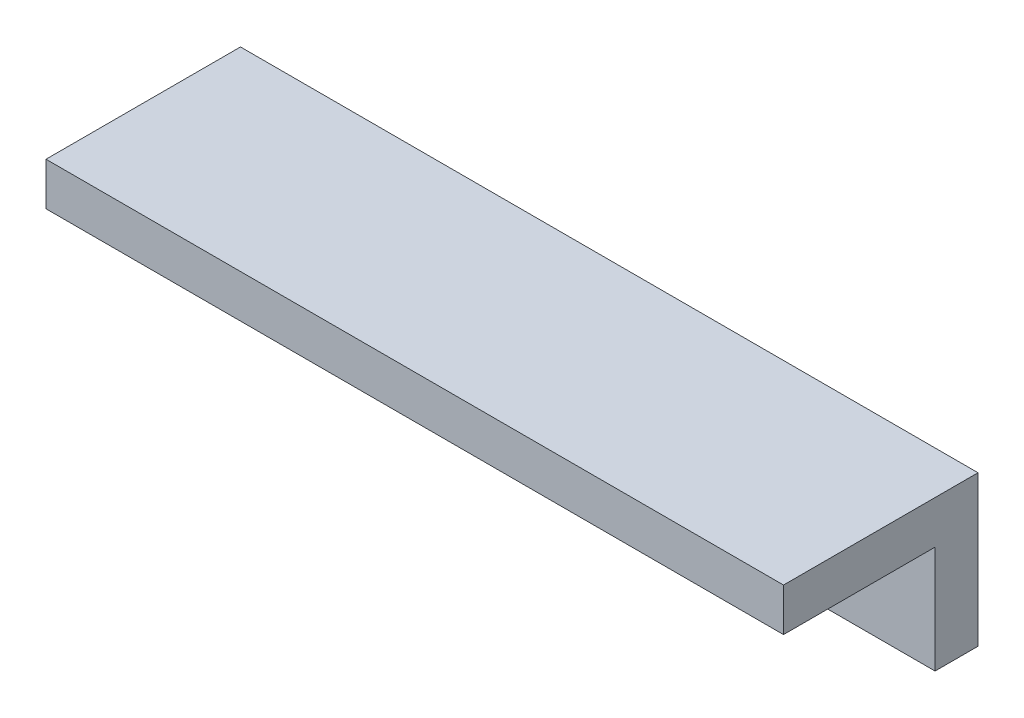
ISO-10303-21;
HEADER;
FILE_DESCRIPTION(('STEP AP214'),'2;1');
FILE_NAME('part.step','',(''),(''),'','','');
FILE_SCHEMA(('AUTOMOTIVE_DESIGN { 1 0 10303 214 1 1 1 1 }'));
ENDSEC;
DATA;
#1=APPLICATION_CONTEXT('core data for automotive mechanical design processes');
#2=APPLICATION_PROTOCOL_DEFINITION('international standard','automotive_design',2000,#1);
#3=PRODUCT_CONTEXT('',#1,'mechanical');
#4=PRODUCT('Part','Part','',(#3));
#5=PRODUCT_RELATED_PRODUCT_CATEGORY('part','',(#4));
#6=PRODUCT_DEFINITION_FORMATION('','',#4);
#7=PRODUCT_DEFINITION_CONTEXT('part definition',#1,'design');
#8=PRODUCT_DEFINITION('design','',#6,#7);
#9=PRODUCT_DEFINITION_SHAPE('','',#8);
#10=(LENGTH_UNIT() NAMED_UNIT(*) SI_UNIT(.MILLI.,.METRE.));
#11=(NAMED_UNIT(*) PLANE_ANGLE_UNIT() SI_UNIT($,.RADIAN.));
#12=(NAMED_UNIT(*) SI_UNIT($,.STERADIAN.) SOLID_ANGLE_UNIT());
#13=UNCERTAINTY_MEASURE_WITH_UNIT(LENGTH_MEASURE(1.E-05),#10,'distance_accuracy_value','');
#14=(GEOMETRIC_REPRESENTATION_CONTEXT(3) GLOBAL_UNCERTAINTY_ASSIGNED_CONTEXT((#13)) GLOBAL_UNIT_ASSIGNED_CONTEXT((#10,
#11,#12)) REPRESENTATION_CONTEXT('',''));
#15=CARTESIAN_POINT('',(0.,0.,0.));
#16=DIRECTION('',(0.,0.,1.));
#17=DIRECTION('',(1.,0.,0.));
#18=AXIS2_PLACEMENT_3D('',#15,#16,#17);
#19=CARTESIAN_POINT('',(0.,0.,38.));
#20=DIRECTION('',(0.,0.,-1.));
#21=DIRECTION('',(-1.,0.,0.));
#22=AXIS2_PLACEMENT_3D('',#19,#20,#21);
#23=PLANE('',#22);
#24=DIRECTION('',(1.,0.,0.));
#25=VECTOR('',#24,1.);
#26=CARTESIAN_POINT('',(-29.2,-133.4,38.));
#27=LINE('',#26,#25);
#28=CARTESIAN_POINT('',(-29.2,-133.4,38.));
#29=VERTEX_POINT('',#28);
#30=CARTESIAN_POINT('',(29.2,-133.4,38.));
#31=VERTEX_POINT('',#30);
#32=EDGE_CURVE('E57',#29,#31,#27,.T.);
#33=ORIENTED_EDGE('',*,*,#32,.F.);
#34=DIRECTION('',(0.,-1.,0.));
#35=VECTOR('',#34,1.);
#36=CARTESIAN_POINT('',(-29.2,-141.9,38.));
#37=LINE('',#36,#35);
#38=CARTESIAN_POINT('',(-29.2,-141.9,38.));
#39=VERTEX_POINT('',#38);
#40=EDGE_CURVE('E93',#29,#39,#37,.T.);
#41=ORIENTED_EDGE('',*,*,#40,.T.);
#42=DIRECTION('',(1.,0.,0.));
#43=VECTOR('',#42,1.);
#44=CARTESIAN_POINT('',(-29.2,-141.9,38.));
#45=LINE('',#44,#43);
#46=CARTESIAN_POINT('',(29.2,-141.9,38.));
#47=VERTEX_POINT('',#46);
#48=EDGE_CURVE('E64',#39,#47,#45,.T.);
#49=ORIENTED_EDGE('',*,*,#48,.T.);
#50=DIRECTION('',(0.,1.,0.));
#51=VECTOR('',#50,1.);
#52=CARTESIAN_POINT('',(29.2,-141.9,38.));
#53=LINE('',#52,#51);
#54=EDGE_CURVE('E104',#47,#31,#53,.T.);
#55=ORIENTED_EDGE('',*,*,#54,.T.);
#56=EDGE_LOOP('',(#33,#41,#49,#55));
#57=FACE_BOUND('',#56,.T.);
#58=ADVANCED_FACE('F41',(#57),#23,.F.);
#59=CARTESIAN_POINT('',(-29.2,-141.9,38.));
#60=DIRECTION('',(1.,0.,0.));
#61=DIRECTION('',(0.,0.,-1.));
#62=AXIS2_PLACEMENT_3D('',#59,#60,#61);
#63=PLANE('',#62);
#64=DIRECTION('',(0.,-1.,0.));
#65=VECTOR('',#64,1.);
#66=CARTESIAN_POINT('',(-29.2,-141.9,34.6));
#67=LINE('',#66,#65);
#68=CARTESIAN_POINT('',(-29.2,-130.,34.6));
#69=VERTEX_POINT('',#68);
#70=CARTESIAN_POINT('',(-29.2,-141.9,34.6));
#71=VERTEX_POINT('',#70);
#72=EDGE_CURVE('E99',#69,#71,#67,.T.);
#73=ORIENTED_EDGE('',*,*,#72,.T.);
#74=DIRECTION('',(0.,0.,-1.));
#75=VECTOR('',#74,1.);
#76=CARTESIAN_POINT('',(-29.2,-141.9,38.));
#77=LINE('',#76,#75);
#78=EDGE_CURVE('E11',#39,#71,#77,.T.);
#79=ORIENTED_EDGE('',*,*,#78,.F.);
#80=ORIENTED_EDGE('',*,*,#40,.F.);
#81=DIRECTION('',(0.,0.,-1.));
#82=VECTOR('',#81,1.);
#83=CARTESIAN_POINT('',(-29.2,-133.4,50.));
#84=LINE('',#83,#82);
#85=CARTESIAN_POINT('',(-29.2,-133.4,50.));
#86=VERTEX_POINT('',#85);
#87=EDGE_CURVE('E108',#86,#29,#84,.T.);
#88=ORIENTED_EDGE('',*,*,#87,.F.);
#89=DIRECTION('',(0.,-1.,0.));
#90=VECTOR('',#89,1.);
#91=CARTESIAN_POINT('',(-29.2,-133.4,50.));
#92=LINE('',#91,#90);
#93=CARTESIAN_POINT('',(-29.2,-130.,50.));
#94=VERTEX_POINT('',#93);
#95=EDGE_CURVE('E101',#94,#86,#92,.T.);
#96=ORIENTED_EDGE('',*,*,#95,.F.);
#97=DIRECTION('',(0.,0.,-1.));
#98=VECTOR('',#97,1.);
#99=CARTESIAN_POINT('',(-29.2,-130.,38.));
#100=LINE('',#99,#98);
#101=EDGE_CURVE('E86',#94,#69,#100,.T.);
#102=ORIENTED_EDGE('',*,*,#101,.T.);
#103=EDGE_LOOP('',(#73,#79,#80,#88,#96,#102));
#104=FACE_BOUND('',#103,.T.);
#105=ADVANCED_FACE('F43',(#104),#63,.F.);
#106=CARTESIAN_POINT('',(-29.2,-141.9,38.));
#107=DIRECTION('',(0.,1.,0.));
#108=DIRECTION('',(0.,0.,1.));
#109=AXIS2_PLACEMENT_3D('',#106,#107,#108);
#110=PLANE('',#109);
#111=DIRECTION('',(1.,0.,0.));
#112=VECTOR('',#111,1.);
#113=CARTESIAN_POINT('',(-29.2,-141.9,34.6));
#114=LINE('',#113,#112);
#115=CARTESIAN_POINT('',(29.2,-141.9,34.6));
#116=VERTEX_POINT('',#115);
#117=EDGE_CURVE('E110',#71,#116,#114,.T.);
#118=ORIENTED_EDGE('',*,*,#117,.T.);
#119=DIRECTION('',(0.,0.,-1.));
#120=VECTOR('',#119,1.);
#121=CARTESIAN_POINT('',(29.2,-141.9,38.));
#122=LINE('',#121,#120);
#123=EDGE_CURVE('E47',#47,#116,#122,.T.);
#124=ORIENTED_EDGE('',*,*,#123,.F.);
#125=ORIENTED_EDGE('',*,*,#48,.F.);
#126=ORIENTED_EDGE('',*,*,#78,.T.);
#127=EDGE_LOOP('',(#118,#124,#125,#126));
#128=FACE_BOUND('',#127,.T.);
#129=ADVANCED_FACE('F121',(#128),#110,.F.);
#130=CARTESIAN_POINT('',(29.2,-141.9,38.));
#131=DIRECTION('',(-1.,0.,0.));
#132=DIRECTION('',(0.,0.,1.));
#133=AXIS2_PLACEMENT_3D('',#130,#131,#132);
#134=PLANE('',#133);
#135=DIRECTION('',(0.,1.,0.));
#136=VECTOR('',#135,1.);
#137=CARTESIAN_POINT('',(29.2,-141.9,34.6));
#138=LINE('',#137,#136);
#139=CARTESIAN_POINT('',(29.2,-130.,34.6));
#140=VERTEX_POINT('',#139);
#141=EDGE_CURVE('E92',#116,#140,#138,.T.);
#142=ORIENTED_EDGE('',*,*,#141,.T.);
#143=DIRECTION('',(0.,0.,-1.));
#144=VECTOR('',#143,1.);
#145=CARTESIAN_POINT('',(29.2,-130.,38.));
#146=LINE('',#145,#144);
#147=CARTESIAN_POINT('',(29.2,-130.,50.));
#148=VERTEX_POINT('',#147);
#149=EDGE_CURVE('E87',#148,#140,#146,.T.);
#150=ORIENTED_EDGE('',*,*,#149,.F.);
#151=DIRECTION('',(0.,1.,0.));
#152=VECTOR('',#151,1.);
#153=CARTESIAN_POINT('',(29.2,-133.4,50.));
#154=LINE('',#153,#152);
#155=CARTESIAN_POINT('',(29.2,-133.4,50.));
#156=VERTEX_POINT('',#155);
#157=EDGE_CURVE('E137',#156,#148,#154,.T.);
#158=ORIENTED_EDGE('',*,*,#157,.F.);
#159=DIRECTION('',(0.,0.,-1.));
#160=VECTOR('',#159,1.);
#161=CARTESIAN_POINT('',(29.2,-133.4,50.));
#162=LINE('',#161,#160);
#163=EDGE_CURVE('E115',#156,#31,#162,.T.);
#164=ORIENTED_EDGE('',*,*,#163,.T.);
#165=ORIENTED_EDGE('',*,*,#54,.F.);
#166=ORIENTED_EDGE('',*,*,#123,.T.);
#167=EDGE_LOOP('',(#142,#150,#158,#164,#165,#166));
#168=FACE_BOUND('',#167,.T.);
#169=ADVANCED_FACE('F122',(#168),#134,.F.);
#170=CARTESIAN_POINT('',(-29.2,-130.,38.));
#171=DIRECTION('',(0.,-1.,0.));
#172=DIRECTION('',(0.,0.,-1.));
#173=AXIS2_PLACEMENT_3D('',#170,#171,#172);
#174=PLANE('',#173);
#175=DIRECTION('',(-1.,0.,0.));
#176=VECTOR('',#175,1.);
#177=CARTESIAN_POINT('',(-29.2,-130.,34.6));
#178=LINE('',#177,#176);
#179=EDGE_CURVE('E84',#140,#69,#178,.T.);
#180=ORIENTED_EDGE('',*,*,#179,.T.);
#181=ORIENTED_EDGE('',*,*,#101,.F.);
#182=DIRECTION('',(-1.,0.,0.));
#183=VECTOR('',#182,1.);
#184=CARTESIAN_POINT('',(-29.2,-130.,50.));
#185=LINE('',#184,#183);
#186=EDGE_CURVE('E145',#148,#94,#185,.T.);
#187=ORIENTED_EDGE('',*,*,#186,.F.);
#188=ORIENTED_EDGE('',*,*,#149,.T.);
#189=EDGE_LOOP('',(#180,#181,#187,#188));
#190=FACE_BOUND('',#189,.T.);
#191=ADVANCED_FACE('F85',(#190),#174,.F.);
#192=CARTESIAN_POINT('',(0.,0.,34.6));
#193=DIRECTION('',(0.,0.,-1.));
#194=DIRECTION('',(-1.,0.,0.));
#195=AXIS2_PLACEMENT_3D('',#192,#193,#194);
#196=PLANE('',#195);
#197=ORIENTED_EDGE('',*,*,#72,.F.);
#198=ORIENTED_EDGE('',*,*,#179,.F.);
#199=ORIENTED_EDGE('',*,*,#141,.F.);
#200=ORIENTED_EDGE('',*,*,#117,.F.);
#201=EDGE_LOOP('',(#197,#198,#199,#200));
#202=FACE_BOUND('',#201,.T.);
#203=ADVANCED_FACE('F106',(#202),#196,.T.);
#204=CARTESIAN_POINT('',(-29.2,-133.4,50.));
#205=DIRECTION('',(0.,1.,0.));
#206=DIRECTION('',(0.,0.,1.));
#207=AXIS2_PLACEMENT_3D('',#204,#205,#206);
#208=PLANE('',#207);
#209=ORIENTED_EDGE('',*,*,#32,.T.);
#210=ORIENTED_EDGE('',*,*,#163,.F.);
#211=DIRECTION('',(1.,0.,0.));
#212=VECTOR('',#211,1.);
#213=CARTESIAN_POINT('',(-29.2,-133.4,50.));
#214=LINE('',#213,#212);
#215=EDGE_CURVE('E133',#86,#156,#214,.T.);
#216=ORIENTED_EDGE('',*,*,#215,.F.);
#217=ORIENTED_EDGE('',*,*,#87,.T.);
#218=EDGE_LOOP('',(#209,#210,#216,#217));
#219=FACE_BOUND('',#218,.T.);
#220=ADVANCED_FACE('F130',(#219),#208,.F.);
#221=CARTESIAN_POINT('',(0.,0.,50.));
#222=DIRECTION('',(0.,0.,-1.));
#223=DIRECTION('',(-1.,0.,0.));
#224=AXIS2_PLACEMENT_3D('',#221,#222,#223);
#225=PLANE('',#224);
#226=ORIENTED_EDGE('',*,*,#95,.T.);
#227=ORIENTED_EDGE('',*,*,#215,.T.);
#228=ORIENTED_EDGE('',*,*,#157,.T.);
#229=ORIENTED_EDGE('',*,*,#186,.T.);
#230=EDGE_LOOP('',(#226,#227,#228,#229));
#231=FACE_BOUND('',#230,.T.);
#232=ADVANCED_FACE('F142',(#231),#225,.F.);
#233=CLOSED_SHELL('',(#58,#105,#129,#169,#191,#203,#220,#232));
#234=MANIFOLD_SOLID_BREP('B2',#233);
#235=ADVANCED_BREP_SHAPE_REPRESENTATION('',(#18,#234),#14);
#236=SHAPE_DEFINITION_REPRESENTATION(#9,#235);
ENDSEC;
END-ISO-10303-21;
